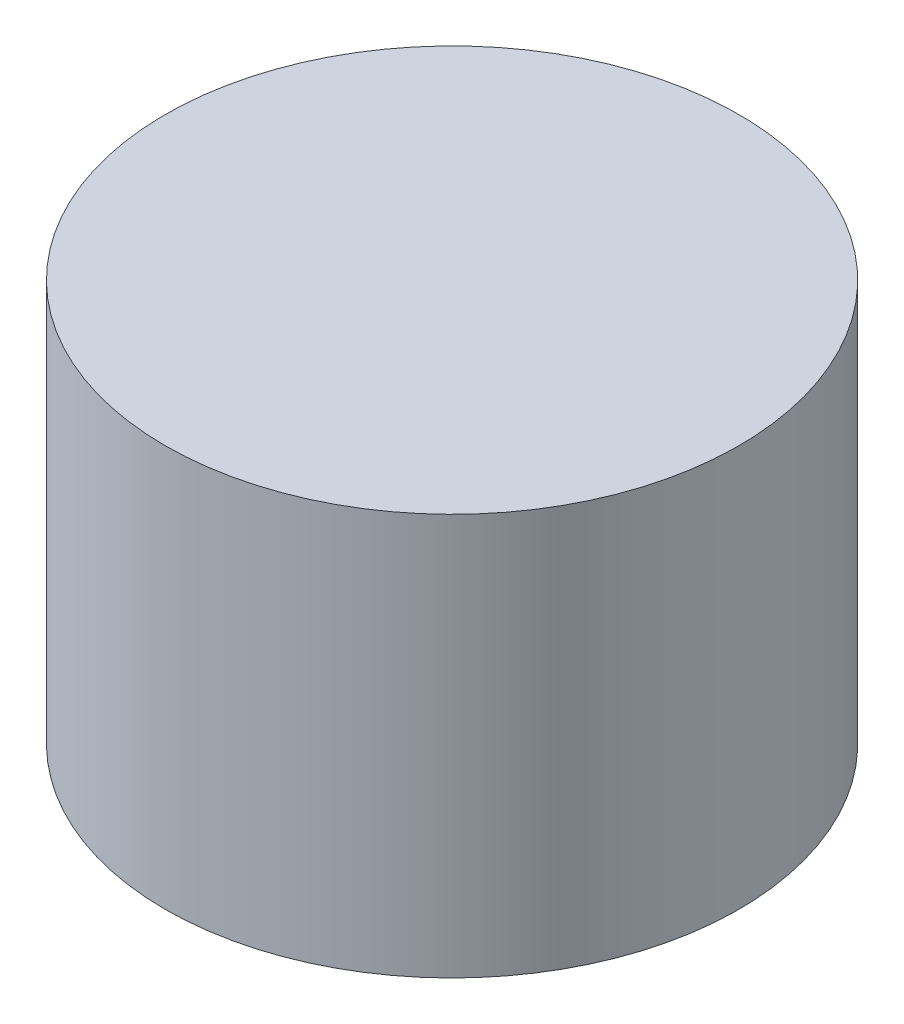
ISO-10303-21;
HEADER;
FILE_DESCRIPTION(('STEP AP214'),'2;1');
FILE_NAME('part.step','',(''),(''),'','','');
FILE_SCHEMA(('AUTOMOTIVE_DESIGN { 1 0 10303 214 1 1 1 1 }'));
ENDSEC;
DATA;
#1=APPLICATION_CONTEXT('core data for automotive mechanical design processes');
#2=APPLICATION_PROTOCOL_DEFINITION('international standard','automotive_design',2000,#1);
#3=PRODUCT_CONTEXT('',#1,'mechanical');
#4=PRODUCT('Part','Part','',(#3));
#5=PRODUCT_RELATED_PRODUCT_CATEGORY('part','',(#4));
#6=PRODUCT_DEFINITION_FORMATION('','',#4);
#7=PRODUCT_DEFINITION_CONTEXT('part definition',#1,'design');
#8=PRODUCT_DEFINITION('design','',#6,#7);
#9=PRODUCT_DEFINITION_SHAPE('','',#8);
#10=(LENGTH_UNIT() NAMED_UNIT(*) SI_UNIT(.MILLI.,.METRE.));
#11=(NAMED_UNIT(*) PLANE_ANGLE_UNIT() SI_UNIT($,.RADIAN.));
#12=(NAMED_UNIT(*) SI_UNIT($,.STERADIAN.) SOLID_ANGLE_UNIT());
#13=UNCERTAINTY_MEASURE_WITH_UNIT(LENGTH_MEASURE(1.E-05),#10,'distance_accuracy_value','');
#14=(GEOMETRIC_REPRESENTATION_CONTEXT(3) GLOBAL_UNCERTAINTY_ASSIGNED_CONTEXT((#13)) GLOBAL_UNIT_ASSIGNED_CONTEXT((#10,
#11,#12)) REPRESENTATION_CONTEXT('',''));
#15=CARTESIAN_POINT('',(0.,0.,0.));
#16=DIRECTION('',(0.,0.,1.));
#17=DIRECTION('',(1.,0.,0.));
#18=AXIS2_PLACEMENT_3D('',#15,#16,#17);
#19=CARTESIAN_POINT('',(0.,0.,0.));
#20=DIRECTION('',(0.,1.,0.));
#21=DIRECTION('',(0.,0.,1.));
#22=AXIS2_PLACEMENT_3D('',#19,#20,#21);
#23=PLANE('',#22);
#24=CARTESIAN_POINT('',(0.,0.,0.));
#25=DIRECTION('',(0.,1.,0.));
#26=DIRECTION('',(0.,0.,1.));
#27=AXIS2_PLACEMENT_3D('',#24,#25,#26);
#28=CIRCLE('',#27,5.);
#29=CARTESIAN_POINT('',(0.,0.,5.));
#30=VERTEX_POINT('',#29);
#31=EDGE_CURVE('E10',#30,#30,#28,.T.);
#32=ORIENTED_EDGE('',*,*,#31,.F.);
#33=EDGE_LOOP('',(#32));
#34=FACE_BOUND('',#33,.T.);
#35=CARTESIAN_POINT('',(0.,0.,0.));
#36=DIRECTION('',(0.,1.,0.));
#37=DIRECTION('',(0.,0.,1.));
#38=AXIS2_PLACEMENT_3D('',#35,#36,#37);
#39=CIRCLE('',#38,4.);
#40=CARTESIAN_POINT('',(0.,0.,4.));
#41=VERTEX_POINT('',#40);
#42=EDGE_CURVE('E38',#41,#41,#39,.T.);
#43=ORIENTED_EDGE('',*,*,#42,.T.);
#44=EDGE_LOOP('',(#43));
#45=FACE_BOUND('',#44,.T.);
#46=ADVANCED_FACE('F31',(#34,#45),#23,.F.);
#47=CARTESIAN_POINT('',(0.,5.,0.));
#48=DIRECTION('',(0.,-1.,0.));
#49=DIRECTION('',(0.,0.,-1.));
#50=AXIS2_PLACEMENT_3D('',#47,#48,#49);
#51=CYLINDRICAL_SURFACE('',#50,5.);
#52=ORIENTED_EDGE('',*,*,#31,.T.);
#53=EDGE_LOOP('',(#52));
#54=FACE_BOUND('',#53,.T.);
#55=CARTESIAN_POINT('',(0.,7.,0.));
#56=DIRECTION('',(0.,1.,0.));
#57=DIRECTION('',(0.,0.,1.));
#58=AXIS2_PLACEMENT_3D('',#55,#56,#57);
#59=CIRCLE('',#58,5.);
#60=CARTESIAN_POINT('',(0.,7.,5.));
#61=VERTEX_POINT('',#60);
#62=EDGE_CURVE('E46',#61,#61,#59,.T.);
#63=ORIENTED_EDGE('',*,*,#62,.F.);
#64=EDGE_LOOP('',(#63));
#65=FACE_BOUND('',#64,.T.);
#66=ADVANCED_FACE('F33',(#54,#65),#51,.T.);
#67=CARTESIAN_POINT('',(0.,5.,0.));
#68=DIRECTION('',(0.,-1.,0.));
#69=DIRECTION('',(0.,0.,-1.));
#70=AXIS2_PLACEMENT_3D('',#67,#68,#69);
#71=CYLINDRICAL_SURFACE('',#70,4.);
#72=CARTESIAN_POINT('',(0.,5.,0.));
#73=DIRECTION('',(0.,1.,0.));
#74=DIRECTION('',(0.,0.,1.));
#75=AXIS2_PLACEMENT_3D('',#72,#73,#74);
#76=CIRCLE('',#75,4.);
#77=CARTESIAN_POINT('',(0.,5.,4.));
#78=VERTEX_POINT('',#77);
#79=EDGE_CURVE('E42',#78,#78,#76,.T.);
#80=ORIENTED_EDGE('',*,*,#79,.T.);
#81=EDGE_LOOP('',(#80));
#82=FACE_BOUND('',#81,.T.);
#83=ORIENTED_EDGE('',*,*,#42,.F.);
#84=EDGE_LOOP('',(#83));
#85=FACE_BOUND('',#84,.T.);
#86=ADVANCED_FACE('F55',(#82,#85),#71,.F.);
#87=CARTESIAN_POINT('',(0.,5.,0.));
#88=DIRECTION('',(0.,1.,0.));
#89=DIRECTION('',(0.,0.,1.));
#90=AXIS2_PLACEMENT_3D('',#87,#88,#89);
#91=PLANE('',#90);
#92=ORIENTED_EDGE('',*,*,#79,.F.);
#93=EDGE_LOOP('',(#92));
#94=FACE_BOUND('',#93,.T.);
#95=ADVANCED_FACE('F60',(#94),#91,.F.);
#96=CARTESIAN_POINT('',(0.,7.,0.));
#97=DIRECTION('',(0.,1.,0.));
#98=DIRECTION('',(0.,0.,1.));
#99=AXIS2_PLACEMENT_3D('',#96,#97,#98);
#100=PLANE('',#99);
#101=ORIENTED_EDGE('',*,*,#62,.T.);
#102=EDGE_LOOP('',(#101));
#103=FACE_BOUND('',#102,.T.);
#104=ADVANCED_FACE('F52',(#103),#100,.T.);
#105=CLOSED_SHELL('',(#46,#66,#86,#95,#104));
#106=MANIFOLD_SOLID_BREP('B2',#105);
#107=ADVANCED_BREP_SHAPE_REPRESENTATION('',(#18,#106),#14);
#108=SHAPE_DEFINITION_REPRESENTATION(#9,#107);
ENDSEC;
END-ISO-10303-21;
